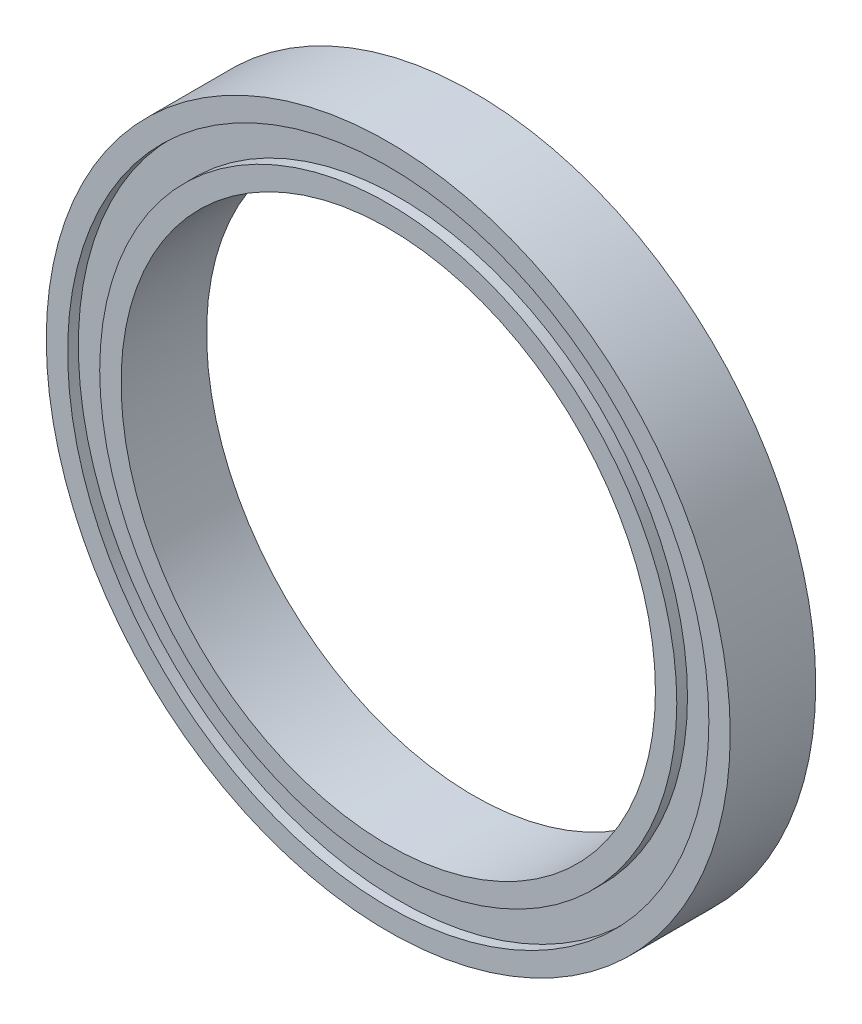
ISO-10303-21;
HEADER;
FILE_DESCRIPTION(('STEP AP214'),'2;1');
FILE_NAME('part.step','',(''),(''),'','','');
FILE_SCHEMA(('AUTOMOTIVE_DESIGN { 1 0 10303 214 1 1 1 1 }'));
ENDSEC;
DATA;
#1=APPLICATION_CONTEXT('core data for automotive mechanical design processes');
#2=APPLICATION_PROTOCOL_DEFINITION('international standard','automotive_design',2000,#1);
#3=PRODUCT_CONTEXT('',#1,'mechanical');
#4=PRODUCT('Part','Part','',(#3));
#5=PRODUCT_RELATED_PRODUCT_CATEGORY('part','',(#4));
#6=PRODUCT_DEFINITION_FORMATION('','',#4);
#7=PRODUCT_DEFINITION_CONTEXT('part definition',#1,'design');
#8=PRODUCT_DEFINITION('design','',#6,#7);
#9=PRODUCT_DEFINITION_SHAPE('','',#8);
#10=(LENGTH_UNIT() NAMED_UNIT(*) SI_UNIT(.MILLI.,.METRE.));
#11=(NAMED_UNIT(*) PLANE_ANGLE_UNIT() SI_UNIT($,.RADIAN.));
#12=(NAMED_UNIT(*) SI_UNIT($,.STERADIAN.) SOLID_ANGLE_UNIT());
#13=UNCERTAINTY_MEASURE_WITH_UNIT(LENGTH_MEASURE(1.E-05),#10,'distance_accuracy_value','');
#14=(GEOMETRIC_REPRESENTATION_CONTEXT(3) GLOBAL_UNCERTAINTY_ASSIGNED_CONTEXT((#13)) GLOBAL_UNIT_ASSIGNED_CONTEXT((#10,
#11,#12)) REPRESENTATION_CONTEXT('',''));
#15=CARTESIAN_POINT('',(0.,0.,0.));
#16=DIRECTION('',(0.,0.,1.));
#17=DIRECTION('',(1.,0.,0.));
#18=AXIS2_PLACEMENT_3D('',#15,#16,#17);
#19=CARTESIAN_POINT('',(0.,0.,4.));
#20=DIRECTION('',(0.,0.,-1.));
#21=DIRECTION('',(-1.,0.,0.));
#22=AXIS2_PLACEMENT_3D('',#19,#20,#21);
#23=CYLINDRICAL_SURFACE('',#22,13.5);
#24=CARTESIAN_POINT('',(0.,0.,0.));
#25=DIRECTION('',(0.,0.,1.));
#26=DIRECTION('',(1.,0.,0.));
#27=AXIS2_PLACEMENT_3D('',#24,#25,#26);
#28=CIRCLE('',#27,13.5);
#29=CARTESIAN_POINT('',(13.5,0.,0.));
#30=VERTEX_POINT('',#29);
#31=EDGE_CURVE('E54',#30,#30,#28,.T.);
#32=ORIENTED_EDGE('',*,*,#31,.T.);
#33=EDGE_LOOP('',(#32));
#34=FACE_BOUND('',#33,.T.);
#35=CARTESIAN_POINT('',(0.,0.,0.5));
#36=DIRECTION('',(0.,0.,1.));
#37=DIRECTION('',(1.,0.,0.));
#38=AXIS2_PLACEMENT_3D('',#35,#36,#37);
#39=CIRCLE('',#38,13.5);
#40=CARTESIAN_POINT('',(13.5,0.,0.5));
#41=VERTEX_POINT('',#40);
#42=EDGE_CURVE('E11',#41,#41,#39,.T.);
#43=ORIENTED_EDGE('',*,*,#42,.F.);
#44=EDGE_LOOP('',(#43));
#45=FACE_BOUND('',#44,.T.);
#46=ADVANCED_FACE('F38',(#34,#45),#23,.T.);
#47=CARTESIAN_POINT('',(0.,0.,4.));
#48=DIRECTION('',(0.,0.,-1.));
#49=DIRECTION('',(-1.,0.,0.));
#50=AXIS2_PLACEMENT_3D('',#47,#48,#49);
#51=CYLINDRICAL_SURFACE('',#50,12.5);
#52=CARTESIAN_POINT('',(0.,0.,4.));
#53=DIRECTION('',(0.,0.,1.));
#54=DIRECTION('',(1.,0.,0.));
#55=AXIS2_PLACEMENT_3D('',#52,#53,#54);
#56=CIRCLE('',#55,12.5);
#57=CARTESIAN_POINT('',(12.5,0.,4.));
#58=VERTEX_POINT('',#57);
#59=EDGE_CURVE('E49',#58,#58,#56,.T.);
#60=ORIENTED_EDGE('',*,*,#59,.T.);
#61=EDGE_LOOP('',(#60));
#62=FACE_BOUND('',#61,.T.);
#63=CARTESIAN_POINT('',(0.,0.,0.));
#64=DIRECTION('',(0.,0.,1.));
#65=DIRECTION('',(1.,0.,0.));
#66=AXIS2_PLACEMENT_3D('',#63,#64,#65);
#67=CIRCLE('',#66,12.5);
#68=CARTESIAN_POINT('',(12.5,0.,0.));
#69=VERTEX_POINT('',#68);
#70=EDGE_CURVE('E58',#69,#69,#67,.T.);
#71=ORIENTED_EDGE('',*,*,#70,.F.);
#72=EDGE_LOOP('',(#71));
#73=FACE_BOUND('',#72,.T.);
#74=ADVANCED_FACE('F40',(#62,#73),#51,.F.);
#75=CARTESIAN_POINT('',(0.,0.,3.5));
#76=DIRECTION('',(0.,0.,1.));
#77=DIRECTION('',(1.,0.,0.));
#78=AXIS2_PLACEMENT_3D('',#75,#76,#77);
#79=CIRCLE('',#78,13.5);
#80=CARTESIAN_POINT('',(13.5,0.,3.5));
#81=VERTEX_POINT('',#80);
#82=EDGE_CURVE('E93',#81,#81,#79,.T.);
#83=ORIENTED_EDGE('',*,*,#82,.T.);
#84=EDGE_LOOP('',(#83));
#85=FACE_BOUND('',#84,.T.);
#86=CARTESIAN_POINT('',(0.,0.,4.));
#87=DIRECTION('',(0.,0.,1.));
#88=DIRECTION('',(1.,0.,0.));
#89=AXIS2_PLACEMENT_3D('',#86,#87,#88);
#90=CIRCLE('',#89,13.5);
#91=CARTESIAN_POINT('',(13.5,0.,4.));
#92=VERTEX_POINT('',#91);
#93=EDGE_CURVE('E45',#92,#92,#90,.T.);
#94=ORIENTED_EDGE('',*,*,#93,.F.);
#95=EDGE_LOOP('',(#94));
#96=FACE_BOUND('',#95,.T.);
#97=ADVANCED_FACE('F78',(#85,#96),#23,.T.);
#98=CARTESIAN_POINT('',(0.,0.,4.));
#99=DIRECTION('',(0.,0.,1.));
#100=DIRECTION('',(1.,0.,0.));
#101=AXIS2_PLACEMENT_3D('',#98,#99,#100);
#102=PLANE('',#101);
#103=ORIENTED_EDGE('',*,*,#59,.F.);
#104=EDGE_LOOP('',(#103));
#105=FACE_BOUND('',#104,.T.);
#106=ORIENTED_EDGE('',*,*,#93,.T.);
#107=EDGE_LOOP('',(#106));
#108=FACE_BOUND('',#107,.T.);
#109=ADVANCED_FACE('F69',(#105,#108),#102,.T.);
#110=CARTESIAN_POINT('',(0.,0.,0.));
#111=DIRECTION('',(0.,0.,1.));
#112=DIRECTION('',(1.,0.,0.));
#113=AXIS2_PLACEMENT_3D('',#110,#111,#112);
#114=PLANE('',#113);
#115=ORIENTED_EDGE('',*,*,#70,.T.);
#116=EDGE_LOOP('',(#115));
#117=FACE_BOUND('',#116,.T.);
#118=ORIENTED_EDGE('',*,*,#31,.F.);
#119=EDGE_LOOP('',(#118));
#120=FACE_BOUND('',#119,.T.);
#121=ADVANCED_FACE('F66',(#117,#120),#114,.F.);
#122=CARTESIAN_POINT('',(0.,0.,0.5));
#123=DIRECTION('',(0.,0.,1.));
#124=DIRECTION('',(1.,0.,0.));
#125=AXIS2_PLACEMENT_3D('',#122,#123,#124);
#126=PLANE('',#125);
#127=ORIENTED_EDGE('',*,*,#42,.T.);
#128=EDGE_LOOP('',(#127));
#129=FACE_BOUND('',#128,.T.);
#130=CARTESIAN_POINT('',(0.,0.,0.5));
#131=DIRECTION('',(0.,0.,1.));
#132=DIRECTION('',(1.,0.,0.));
#133=AXIS2_PLACEMENT_3D('',#130,#131,#132);
#134=CIRCLE('',#133,15.);
#135=CARTESIAN_POINT('',(15.,0.,0.5));
#136=VERTEX_POINT('',#135);
#137=EDGE_CURVE('E60',#136,#136,#134,.T.);
#138=ORIENTED_EDGE('',*,*,#137,.F.);
#139=EDGE_LOOP('',(#138));
#140=FACE_BOUND('',#139,.T.);
#141=ADVANCED_FACE('F68',(#129,#140),#126,.F.);
#142=CARTESIAN_POINT('',(0.,0.,3.5));
#143=DIRECTION('',(0.,0.,1.));
#144=DIRECTION('',(1.,0.,0.));
#145=AXIS2_PLACEMENT_3D('',#142,#143,#144);
#146=PLANE('',#145);
#147=ORIENTED_EDGE('',*,*,#82,.F.);
#148=EDGE_LOOP('',(#147));
#149=FACE_BOUND('',#148,.T.);
#150=CARTESIAN_POINT('',(0.,0.,3.5));
#151=DIRECTION('',(0.,0.,1.));
#152=DIRECTION('',(1.,0.,0.));
#153=AXIS2_PLACEMENT_3D('',#150,#151,#152);
#154=CIRCLE('',#153,15.);
#155=CARTESIAN_POINT('',(15.,0.,3.5));
#156=VERTEX_POINT('',#155);
#157=EDGE_CURVE('E95',#156,#156,#154,.F.);
#158=ORIENTED_EDGE('',*,*,#157,.F.);
#159=EDGE_LOOP('',(#158));
#160=FACE_BOUND('',#159,.T.);
#161=ADVANCED_FACE('F76',(#149,#160),#146,.T.);
#162=CARTESIAN_POINT('',(0.,0.,4.));
#163=DIRECTION('',(0.,0.,-1.));
#164=DIRECTION('',(-1.,0.,0.));
#165=AXIS2_PLACEMENT_3D('',#162,#163,#164);
#166=CYLINDRICAL_SURFACE('',#165,15.);
#167=CARTESIAN_POINT('',(0.,0.,0.));
#168=DIRECTION('',(0.,0.,1.));
#169=DIRECTION('',(1.,0.,0.));
#170=AXIS2_PLACEMENT_3D('',#167,#168,#169);
#171=CIRCLE('',#170,15.);
#172=CARTESIAN_POINT('',(15.,0.,0.));
#173=VERTEX_POINT('',#172);
#174=EDGE_CURVE('E106',#173,#173,#171,.T.);
#175=ORIENTED_EDGE('',*,*,#174,.F.);
#176=EDGE_LOOP('',(#175));
#177=FACE_BOUND('',#176,.T.);
#178=ORIENTED_EDGE('',*,*,#137,.T.);
#179=EDGE_LOOP('',(#178));
#180=FACE_BOUND('',#179,.T.);
#181=ADVANCED_FACE('F136',(#177,#180),#166,.F.);
#182=ORIENTED_EDGE('',*,*,#157,.T.);
#183=EDGE_LOOP('',(#182));
#184=FACE_BOUND('',#183,.T.);
#185=CARTESIAN_POINT('',(0.,0.,4.));
#186=DIRECTION('',(0.,0.,1.));
#187=DIRECTION('',(1.,0.,0.));
#188=AXIS2_PLACEMENT_3D('',#185,#186,#187);
#189=CIRCLE('',#188,15.);
#190=CARTESIAN_POINT('',(15.,0.,4.));
#191=VERTEX_POINT('',#190);
#192=EDGE_CURVE('E105',#191,#191,#189,.T.);
#193=ORIENTED_EDGE('',*,*,#192,.T.);
#194=EDGE_LOOP('',(#193));
#195=FACE_BOUND('',#194,.T.);
#196=ADVANCED_FACE('F114',(#184,#195),#166,.F.);
#197=CARTESIAN_POINT('',(0.,0.,4.));
#198=DIRECTION('',(0.,0.,-1.));
#199=DIRECTION('',(-1.,0.,0.));
#200=AXIS2_PLACEMENT_3D('',#197,#198,#199);
#201=CYLINDRICAL_SURFACE('',#200,16.);
#202=CARTESIAN_POINT('',(0.,0.,4.));
#203=DIRECTION('',(0.,0.,1.));
#204=DIRECTION('',(1.,0.,0.));
#205=AXIS2_PLACEMENT_3D('',#202,#203,#204);
#206=CIRCLE('',#205,16.);
#207=CARTESIAN_POINT('',(16.,0.,4.));
#208=VERTEX_POINT('',#207);
#209=EDGE_CURVE('E99',#208,#208,#206,.T.);
#210=ORIENTED_EDGE('',*,*,#209,.F.);
#211=EDGE_LOOP('',(#210));
#212=FACE_BOUND('',#211,.T.);
#213=CARTESIAN_POINT('',(0.,0.,0.));
#214=DIRECTION('',(0.,0.,1.));
#215=DIRECTION('',(1.,0.,0.));
#216=AXIS2_PLACEMENT_3D('',#213,#214,#215);
#217=CIRCLE('',#216,16.);
#218=CARTESIAN_POINT('',(16.,0.,0.));
#219=VERTEX_POINT('',#218);
#220=EDGE_CURVE('E102',#219,#219,#217,.T.);
#221=ORIENTED_EDGE('',*,*,#220,.T.);
#222=EDGE_LOOP('',(#221));
#223=FACE_BOUND('',#222,.T.);
#224=ADVANCED_FACE('F120',(#212,#223),#201,.T.);
#225=CARTESIAN_POINT('',(0.,0.,4.));
#226=DIRECTION('',(0.,0.,1.));
#227=DIRECTION('',(1.,0.,0.));
#228=AXIS2_PLACEMENT_3D('',#225,#226,#227);
#229=PLANE('',#228);
#230=ORIENTED_EDGE('',*,*,#192,.F.);
#231=EDGE_LOOP('',(#230));
#232=FACE_BOUND('',#231,.T.);
#233=ORIENTED_EDGE('',*,*,#209,.T.);
#234=EDGE_LOOP('',(#233));
#235=FACE_BOUND('',#234,.T.);
#236=ADVANCED_FACE('F116',(#232,#235),#229,.T.);
#237=CARTESIAN_POINT('',(0.,0.,0.));
#238=DIRECTION('',(0.,0.,1.));
#239=DIRECTION('',(1.,0.,0.));
#240=AXIS2_PLACEMENT_3D('',#237,#238,#239);
#241=PLANE('',#240);
#242=ORIENTED_EDGE('',*,*,#174,.T.);
#243=EDGE_LOOP('',(#242));
#244=FACE_BOUND('',#243,.T.);
#245=ORIENTED_EDGE('',*,*,#220,.F.);
#246=EDGE_LOOP('',(#245));
#247=FACE_BOUND('',#246,.T.);
#248=ADVANCED_FACE('F119',(#244,#247),#241,.F.);
#249=CLOSED_SHELL('',(#46,#74,#97,#109,#121,#141,#161,#181,#196,#224,#236,#248));
#250=MANIFOLD_SOLID_BREP('B2',#249);
#251=ADVANCED_BREP_SHAPE_REPRESENTATION('',(#18,#250),#14);
#252=SHAPE_DEFINITION_REPRESENTATION(#9,#251);
ENDSEC;
END-ISO-10303-21;
